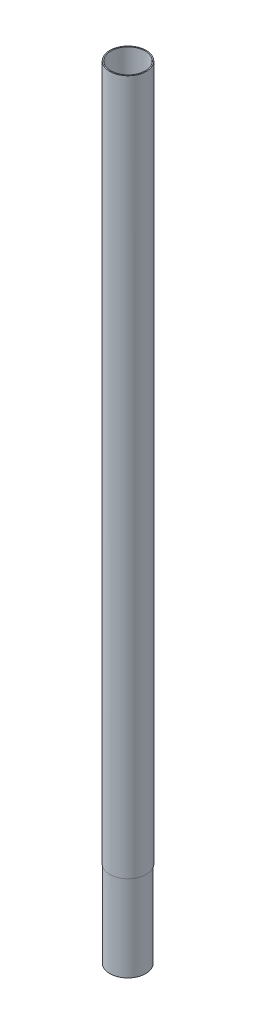
ISO-10303-21;
HEADER;
FILE_DESCRIPTION(('STEP AP214'),'2;1');
FILE_NAME('part.step','',(''),(''),'','','');
FILE_SCHEMA(('AUTOMOTIVE_DESIGN { 1 0 10303 214 1 1 1 1 }'));
ENDSEC;
DATA;
#1=APPLICATION_CONTEXT('core data for automotive mechanical design processes');
#2=APPLICATION_PROTOCOL_DEFINITION('international standard','automotive_design',2000,#1);
#3=PRODUCT_CONTEXT('',#1,'mechanical');
#4=PRODUCT('Part','Part','',(#3));
#5=PRODUCT_RELATED_PRODUCT_CATEGORY('part','',(#4));
#6=PRODUCT_DEFINITION_FORMATION('','',#4);
#7=PRODUCT_DEFINITION_CONTEXT('part definition',#1,'design');
#8=PRODUCT_DEFINITION('design','',#6,#7);
#9=PRODUCT_DEFINITION_SHAPE('','',#8);
#10=(LENGTH_UNIT() NAMED_UNIT(*) SI_UNIT(.MILLI.,.METRE.));
#11=(NAMED_UNIT(*) PLANE_ANGLE_UNIT() SI_UNIT($,.RADIAN.));
#12=(NAMED_UNIT(*) SI_UNIT($,.STERADIAN.) SOLID_ANGLE_UNIT());
#13=UNCERTAINTY_MEASURE_WITH_UNIT(LENGTH_MEASURE(1.E-05),#10,'distance_accuracy_value','');
#14=(GEOMETRIC_REPRESENTATION_CONTEXT(3) GLOBAL_UNCERTAINTY_ASSIGNED_CONTEXT((#13)) GLOBAL_UNIT_ASSIGNED_CONTEXT((#10,
#11,#12)) REPRESENTATION_CONTEXT('',''));
#15=CARTESIAN_POINT('',(0.,0.,0.));
#16=DIRECTION('',(0.,0.,1.));
#17=DIRECTION('',(1.,0.,0.));
#18=AXIS2_PLACEMENT_3D('',#15,#16,#17);
#19=CARTESIAN_POINT('',(9.525,0.,0.));
#20=DIRECTION('',(0.,-1.,0.));
#21=DIRECTION('',(0.,0.,-1.));
#22=AXIS2_PLACEMENT_3D('',#19,#20,#21);
#23=PLANE('',#22);
#24=CARTESIAN_POINT('',(9.525,0.,0.));
#25=DIRECTION('',(0.,1.,0.));
#26=DIRECTION('',(-1.,0.,0.));
#27=AXIS2_PLACEMENT_3D('',#24,#25,#26);
#28=CIRCLE('',#27,8.975);
#29=CARTESIAN_POINT('',(18.5,0.,0.));
#30=VERTEX_POINT('',#29);
#31=EDGE_CURVE('E27',#30,#30,#28,.T.);
#32=ORIENTED_EDGE('',*,*,#31,.F.);
#33=EDGE_LOOP('',(#32));
#34=FACE_BOUND('',#33,.T.);
#35=CARTESIAN_POINT('',(9.525,0.,0.));
#36=DIRECTION('',(0.,-1.,0.));
#37=DIRECTION('',(-1.,0.,0.));
#38=AXIS2_PLACEMENT_3D('',#35,#36,#37);
#39=CIRCLE('',#38,9.525);
#40=CARTESIAN_POINT('',(19.05,0.,0.));
#41=VERTEX_POINT('',#40);
#42=EDGE_CURVE('E64',#41,#41,#39,.T.);
#43=ORIENTED_EDGE('',*,*,#42,.F.);
#44=EDGE_LOOP('',(#43));
#45=FACE_BOUND('',#44,.T.);
#46=ADVANCED_FACE('F17',(#34,#45),#23,.F.);
#47=CARTESIAN_POINT('',(9.525,20.4,0.));
#48=DIRECTION('',(0.,-1.,0.));
#49=DIRECTION('',(-1.,0.,0.));
#50=AXIS2_PLACEMENT_3D('',#47,#48,#49);
#51=CYLINDRICAL_SURFACE('',#50,8.975);
#52=ORIENTED_EDGE('',*,*,#31,.T.);
#53=DIRECTION('',(0.,-1.,0.));
#54=VECTOR('',#53,1.);
#55=CARTESIAN_POINT('',(18.5,20.4,0.));
#56=LINE('',#55,#54);
#57=CARTESIAN_POINT('',(18.5,-408.,0.));
#58=VERTEX_POINT('',#57);
#59=EDGE_CURVE('E11',#30,#58,#56,.T.);
#60=ORIENTED_EDGE('',*,*,#59,.T.);
#61=CARTESIAN_POINT('',(9.525,-408.,0.));
#62=DIRECTION('',(0.,1.,0.));
#63=DIRECTION('',(-1.,0.,0.));
#64=AXIS2_PLACEMENT_3D('',#61,#62,#63);
#65=CIRCLE('',#64,8.975);
#66=EDGE_CURVE('E86',#58,#58,#65,.T.);
#67=ORIENTED_EDGE('',*,*,#66,.F.);
#68=ORIENTED_EDGE('',*,*,#59,.F.);
#69=EDGE_LOOP('',(#52,#60,#67,#68));
#70=FACE_BOUND('',#69,.T.);
#71=ADVANCED_FACE('F102',(#70),#51,.F.);
#72=CARTESIAN_POINT('',(9.525,-408.,0.));
#73=DIRECTION('',(0.,-1.,0.));
#74=DIRECTION('',(0.,0.,-1.));
#75=AXIS2_PLACEMENT_3D('',#72,#73,#74);
#76=PLANE('',#75);
#77=ORIENTED_EDGE('',*,*,#66,.T.);
#78=EDGE_LOOP('',(#77));
#79=FACE_BOUND('',#78,.T.);
#80=CARTESIAN_POINT('',(9.4,-408.,0.));
#81=DIRECTION('',(0.,1.,0.));
#82=DIRECTION('',(1.,0.,0.));
#83=AXIS2_PLACEMENT_3D('',#80,#81,#82);
#84=CIRCLE('',#83,9.4);
#85=CARTESIAN_POINT('',(0.,-408.,0.));
#86=VERTEX_POINT('',#85);
#87=EDGE_CURVE('E57',#86,#86,#84,.T.);
#88=ORIENTED_EDGE('',*,*,#87,.F.);
#89=EDGE_LOOP('',(#88));
#90=FACE_BOUND('',#89,.T.);
#91=ADVANCED_FACE('F100',(#79,#90),#76,.T.);
#92=CARTESIAN_POINT('',(9.4,-410.25,0.));
#93=DIRECTION('',(0.,1.,0.));
#94=DIRECTION('',(1.,0.,0.));
#95=AXIS2_PLACEMENT_3D('',#92,#93,#94);
#96=CYLINDRICAL_SURFACE('',#95,9.4);
#97=CARTESIAN_POINT('',(9.4,-363.,0.));
#98=DIRECTION('',(0.,1.,0.));
#99=DIRECTION('',(1.,0.,0.));
#100=AXIS2_PLACEMENT_3D('',#97,#98,#99);
#101=CIRCLE('',#100,9.4);
#102=CARTESIAN_POINT('',(0.,-363.,0.));
#103=VERTEX_POINT('',#102);
#104=EDGE_CURVE('E70',#103,#103,#101,.T.);
#105=ORIENTED_EDGE('',*,*,#104,.F.);
#106=DIRECTION('',(0.,-1.,0.));
#107=VECTOR('',#106,1.);
#108=CARTESIAN_POINT('',(0.,-410.25,0.));
#109=LINE('',#108,#107);
#110=EDGE_CURVE('E78',#103,#86,#109,.T.);
#111=ORIENTED_EDGE('',*,*,#110,.T.);
#112=ORIENTED_EDGE('',*,*,#87,.T.);
#113=ORIENTED_EDGE('',*,*,#110,.F.);
#114=EDGE_LOOP('',(#105,#111,#112,#113));
#115=FACE_BOUND('',#114,.T.);
#116=ADVANCED_FACE('F114',(#115),#96,.T.);
#117=CARTESIAN_POINT('',(9.4,-363.,0.));
#118=DIRECTION('',(0.,1.,0.));
#119=DIRECTION('',(1.,0.,0.));
#120=AXIS2_PLACEMENT_3D('',#117,#118,#119);
#121=PLANE('',#120);
#122=CARTESIAN_POINT('',(9.525,-363.,0.));
#123=DIRECTION('',(0.,-1.,0.));
#124=DIRECTION('',(-1.,0.,0.));
#125=AXIS2_PLACEMENT_3D('',#122,#123,#124);
#126=CIRCLE('',#125,9.525);
#127=CARTESIAN_POINT('',(19.05,-363.,0.));
#128=VERTEX_POINT('',#127);
#129=EDGE_CURVE('E87',#103,#128,#126,.T.);
#130=ORIENTED_EDGE('',*,*,#129,.T.);
#131=CARTESIAN_POINT('',(9.525,-363.,0.));
#132=DIRECTION('',(0.,-1.,0.));
#133=DIRECTION('',(-1.,0.,0.));
#134=AXIS2_PLACEMENT_3D('',#131,#132,#133);
#135=CIRCLE('',#134,9.525);
#136=EDGE_CURVE('E80',#128,#103,#135,.T.);
#137=ORIENTED_EDGE('',*,*,#136,.T.);
#138=ORIENTED_EDGE('',*,*,#104,.T.);
#139=EDGE_LOOP('',(#130,#137,#138));
#140=FACE_BOUND('',#139,.T.);
#141=ADVANCED_FACE('F117',(#140),#121,.F.);
#142=CARTESIAN_POINT('',(9.525,20.4,0.));
#143=DIRECTION('',(0.,-1.,0.));
#144=DIRECTION('',(-1.,0.,0.));
#145=AXIS2_PLACEMENT_3D('',#142,#143,#144);
#146=CYLINDRICAL_SURFACE('',#145,9.525);
#147=ORIENTED_EDGE('',*,*,#129,.F.);
#148=ORIENTED_EDGE('',*,*,#136,.F.);
#149=DIRECTION('',(0.,1.,0.));
#150=VECTOR('',#149,1.);
#151=CARTESIAN_POINT('',(19.05,20.4,0.));
#152=LINE('',#151,#150);
#153=EDGE_CURVE('E20',#128,#41,#152,.T.);
#154=ORIENTED_EDGE('',*,*,#153,.T.);
#155=ORIENTED_EDGE('',*,*,#42,.T.);
#156=ORIENTED_EDGE('',*,*,#153,.F.);
#157=EDGE_LOOP('',(#147,#148,#154,#155,#156));
#158=FACE_BOUND('',#157,.T.);
#159=ADVANCED_FACE('F66',(#158),#146,.T.);
#160=CLOSED_SHELL('',(#46,#71,#91,#116,#141,#159));
#161=MANIFOLD_SOLID_BREP('B1',#160);
#162=ADVANCED_BREP_SHAPE_REPRESENTATION('',(#18,#161),#14);
#163=SHAPE_DEFINITION_REPRESENTATION(#9,#162);
ENDSEC;
END-ISO-10303-21;
